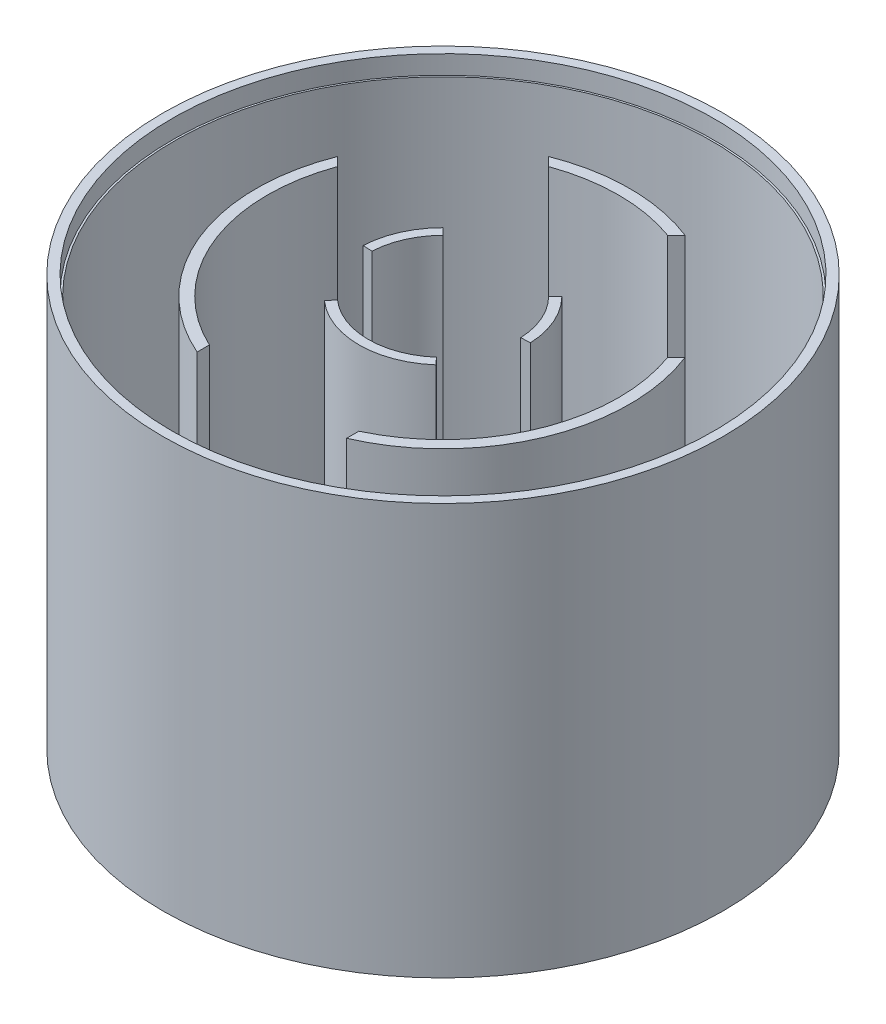
ISO-10303-21;
HEADER;
FILE_DESCRIPTION(('STEP AP214'),'2;1');
FILE_NAME('part.step','',(''),(''),'','','');
FILE_SCHEMA(('AUTOMOTIVE_DESIGN { 1 0 10303 214 1 1 1 1 }'));
ENDSEC;
DATA;
#1=APPLICATION_CONTEXT('core data for automotive mechanical design processes');
#2=APPLICATION_PROTOCOL_DEFINITION('international standard','automotive_design',2000,#1);
#3=PRODUCT_CONTEXT('',#1,'mechanical');
#4=PRODUCT('Part','Part','',(#3));
#5=PRODUCT_RELATED_PRODUCT_CATEGORY('part','',(#4));
#6=PRODUCT_DEFINITION_FORMATION('','',#4);
#7=PRODUCT_DEFINITION_CONTEXT('part definition',#1,'design');
#8=PRODUCT_DEFINITION('design','',#6,#7);
#9=PRODUCT_DEFINITION_SHAPE('','',#8);
#10=(LENGTH_UNIT() NAMED_UNIT(*) SI_UNIT(.MILLI.,.METRE.));
#11=(NAMED_UNIT(*) PLANE_ANGLE_UNIT() SI_UNIT($,.RADIAN.));
#12=(NAMED_UNIT(*) SI_UNIT($,.STERADIAN.) SOLID_ANGLE_UNIT());
#13=UNCERTAINTY_MEASURE_WITH_UNIT(LENGTH_MEASURE(1.E-05),#10,'distance_accuracy_value','');
#14=(GEOMETRIC_REPRESENTATION_CONTEXT(3) GLOBAL_UNCERTAINTY_ASSIGNED_CONTEXT((#13)) GLOBAL_UNIT_ASSIGNED_CONTEXT((#10,
#11,#12)) REPRESENTATION_CONTEXT('',''));
#15=CARTESIAN_POINT('',(0.,0.,0.));
#16=DIRECTION('',(0.,0.,1.));
#17=DIRECTION('',(1.,0.,0.));
#18=AXIS2_PLACEMENT_3D('',#15,#16,#17);
#19=CARTESIAN_POINT('',(0.,105.,0.));
#20=DIRECTION('',(0.,1.,0.));
#21=DIRECTION('',(0.,0.,1.));
#22=AXIS2_PLACEMENT_3D('',#19,#20,#21);
#23=PLANE('',#22);
#24=CARTESIAN_POINT('',(0.,105.,0.));
#25=DIRECTION('',(0.,1.,0.));
#26=DIRECTION('',(0.,0.,1.));
#27=AXIS2_PLACEMENT_3D('',#24,#25,#26);
#28=CIRCLE('',#27,50.);
#29=CARTESIAN_POINT('',(-46.5441828989868,105.,-18.2657887392159));
#30=VERTEX_POINT('',#29);
#31=CARTESIAN_POINT('',(-20.,105.,45.8257569495584));
#32=VERTEX_POINT('',#31);
#33=EDGE_CURVE('E330',#30,#32,#28,.T.);
#34=ORIENTED_EDGE('',*,*,#33,.T.);
#35=DIRECTION('',(0.,0.,-1.));
#36=VECTOR('',#35,1.);
#37=CARTESIAN_POINT('',(-20.,105.,0.));
#38=LINE('',#37,#36);
#39=CARTESIAN_POINT('',(-20.,105.,42.5323406362735));
#40=VERTEX_POINT('',#39);
#41=EDGE_CURVE('E434',#32,#40,#38,.T.);
#42=ORIENTED_EDGE('',*,*,#41,.T.);
#43=CARTESIAN_POINT('',(0.,105.,0.));
#44=DIRECTION('',(0.,1.,0.));
#45=DIRECTION('',(0.,0.,1.));
#46=AXIS2_PLACEMENT_3D('',#43,#44,#45);
#47=CIRCLE('',#46,47.);
#48=CARTESIAN_POINT('',(-44.2154851809154,105.,-15.9370910211446));
#49=VERTEX_POINT('',#48);
#50=EDGE_CURVE('E337',#49,#40,#47,.T.);
#51=ORIENTED_EDGE('',*,*,#50,.F.);
#52=DIRECTION('',(0.707106781186548,0.,0.707106781186547));
#53=VECTOR('',#52,1.);
#54=CARTESIAN_POINT('',(-14.1391970798854,105.,14.1391970798854));
#55=LINE('',#54,#53);
#56=EDGE_CURVE('E425',#30,#49,#55,.T.);
#57=ORIENTED_EDGE('',*,*,#56,.F.);
#58=EDGE_LOOP('',(#34,#42,#51,#57));
#59=FACE_BOUND('',#58,.T.);
#60=ADVANCED_FACE('F91',(#59),#23,.T.);
#61=DIRECTION('',(0.,0.,-1.));
#62=VECTOR('',#61,1.);
#63=CARTESIAN_POINT('',(20.,105.,0.));
#64=LINE('',#63,#62);
#65=CARTESIAN_POINT('',(20.,105.,45.8257569495584));
#66=VERTEX_POINT('',#65);
#67=CARTESIAN_POINT('',(20.,105.,42.5323406362735));
#68=VERTEX_POINT('',#67);
#69=EDGE_CURVE('E446',#66,#68,#64,.T.);
#70=ORIENTED_EDGE('',*,*,#69,.F.);
#71=CARTESIAN_POINT('',(46.547356757383,105.,-18.2576991677734));
#72=VERTEX_POINT('',#71);
#73=EDGE_CURVE('E322',#66,#72,#28,.T.);
#74=ORIENTED_EDGE('',*,*,#73,.T.);
#75=DIRECTION('',(-0.7071655496211,0.,0.707048007867279));
#76=VECTOR('',#75,1.);
#77=CARTESIAN_POINT('',(14.1409601573456,105.,14.143310992422));
#78=LINE('',#77,#76);
#79=CARTESIAN_POINT('',(44.2183662000678,105.,-15.9290957243877));
#80=VERTEX_POINT('',#79);
#81=EDGE_CURVE('E419',#72,#80,#78,.T.);
#82=ORIENTED_EDGE('',*,*,#81,.T.);
#83=EDGE_CURVE('E328',#68,#80,#47,.T.);
#84=ORIENTED_EDGE('',*,*,#83,.F.);
#85=EDGE_LOOP('',(#70,#74,#82,#84));
#86=FACE_BOUND('',#85,.T.);
#87=ADVANCED_FACE('F506',(#86),#23,.T.);
#88=DIRECTION('',(-0.7071655496211,0.,0.707048007867279));
#89=VECTOR('',#88,1.);
#90=CARTESIAN_POINT('',(-14.1409601573456,105.,-14.143310992422));
#91=LINE('',#90,#89);
#92=CARTESIAN_POINT('',(18.2654364426918,105.,-46.5443211526174));
#93=VERTEX_POINT('',#92);
#94=CARTESIAN_POINT('',(15.9364458853766,105.,-44.2157177092317));
#95=VERTEX_POINT('',#94);
#96=EDGE_CURVE('E411',#93,#95,#91,.T.);
#97=ORIENTED_EDGE('',*,*,#96,.F.);
#98=CARTESIAN_POINT('',(-18.257346680159,105.,-46.5474950153119));
#99=VERTEX_POINT('',#98);
#100=EDGE_CURVE('E333',#93,#99,#28,.T.);
#101=ORIENTED_EDGE('',*,*,#100,.T.);
#102=DIRECTION('',(0.707106781186548,0.,0.707106781186548));
#103=VECTOR('',#102,1.);
#104=CARTESIAN_POINT('',(14.1450741675765,105.,-14.1450741675765));
#105=LINE('',#104,#103);
#106=CARTESIAN_POINT('',(-15.9284503480795,105.,-44.2185986832325));
#107=VERTEX_POINT('',#106);
#108=EDGE_CURVE('E427',#99,#107,#105,.T.);
#109=ORIENTED_EDGE('',*,*,#108,.T.);
#110=EDGE_CURVE('E336',#95,#107,#47,.T.);
#111=ORIENTED_EDGE('',*,*,#110,.F.);
#112=EDGE_LOOP('',(#97,#101,#109,#111));
#113=FACE_BOUND('',#112,.T.);
#114=ADVANCED_FACE('F508',(#113),#23,.T.);
#115=CARTESIAN_POINT('',(0.,105.,0.));
#116=DIRECTION('',(0.,-1.,0.));
#117=DIRECTION('',(0.,0.,-1.));
#118=AXIS2_PLACEMENT_3D('',#115,#116,#117);
#119=CYLINDRICAL_SURFACE('',#118,50.);
#120=DIRECTION('',(0.,-1.,0.));
#121=VECTOR('',#120,1.);
#122=CARTESIAN_POINT('',(-20.,105.,45.8257569495584));
#123=LINE('',#122,#121);
#124=CARTESIAN_POINT('',(-20.,10.0000000000001,45.8257569495584));
#125=VERTEX_POINT('',#124);
#126=EDGE_CURVE('E357',#32,#125,#123,.T.);
#127=ORIENTED_EDGE('',*,*,#126,.F.);
#128=ORIENTED_EDGE('',*,*,#33,.F.);
#129=DIRECTION('',(0.,-1.,0.));
#130=VECTOR('',#129,1.);
#131=CARTESIAN_POINT('',(-46.5441828989868,105.,-18.2657887392159));
#132=LINE('',#131,#130);
#133=CARTESIAN_POINT('',(-46.5441828989868,10.0000000000001,-18.2657887392159));
#134=VERTEX_POINT('',#133);
#135=EDGE_CURVE('E375',#30,#134,#132,.T.);
#136=ORIENTED_EDGE('',*,*,#135,.T.);
#137=CARTESIAN_POINT('',(0.,10.0000000000001,0.));
#138=DIRECTION('',(0.,1.,0.));
#139=DIRECTION('',(0.,0.,1.));
#140=AXIS2_PLACEMENT_3D('',#137,#138,#139);
#141=CIRCLE('',#140,50.);
#142=EDGE_CURVE('E324',#134,#125,#141,.T.);
#143=ORIENTED_EDGE('',*,*,#142,.T.);
#144=EDGE_LOOP('',(#127,#128,#136,#143));
#145=FACE_BOUND('',#144,.T.);
#146=ADVANCED_FACE('F517',(#145),#119,.T.);
#147=ORIENTED_EDGE('',*,*,#73,.F.);
#148=DIRECTION('',(0.,-1.,0.));
#149=VECTOR('',#148,1.);
#150=CARTESIAN_POINT('',(20.,105.,45.8257569495584));
#151=LINE('',#150,#149);
#152=CARTESIAN_POINT('',(20.,10.0000000000001,45.8257569495584));
#153=VERTEX_POINT('',#152);
#154=EDGE_CURVE('E352',#66,#153,#151,.T.);
#155=ORIENTED_EDGE('',*,*,#154,.T.);
#156=CARTESIAN_POINT('',(46.547356757383,10.0000000000001,-18.2576991677734));
#157=VERTEX_POINT('',#156);
#158=EDGE_CURVE('E329',#153,#157,#141,.T.);
#159=ORIENTED_EDGE('',*,*,#158,.T.);
#160=DIRECTION('',(0.,-1.,0.));
#161=VECTOR('',#160,1.);
#162=CARTESIAN_POINT('',(46.547356757383,105.,-18.2576991677734));
#163=LINE('',#162,#161);
#164=EDGE_CURVE('E366',#72,#157,#163,.T.);
#165=ORIENTED_EDGE('',*,*,#164,.F.);
#166=EDGE_LOOP('',(#147,#155,#159,#165));
#167=FACE_BOUND('',#166,.T.);
#168=ADVANCED_FACE('F522',(#167),#119,.T.);
#169=ORIENTED_EDGE('',*,*,#100,.F.);
#170=DIRECTION('',(0.,-1.,0.));
#171=VECTOR('',#170,1.);
#172=CARTESIAN_POINT('',(18.2654364426918,105.,-46.5443211526174));
#173=LINE('',#172,#171);
#174=CARTESIAN_POINT('',(18.2654364426918,10.0000000000001,-46.5443211526174));
#175=VERTEX_POINT('',#174);
#176=EDGE_CURVE('E361',#93,#175,#173,.T.);
#177=ORIENTED_EDGE('',*,*,#176,.T.);
#178=CARTESIAN_POINT('',(-18.257346680159,10.0000000000001,-46.5474950153119));
#179=VERTEX_POINT('',#178);
#180=EDGE_CURVE('E327',#175,#179,#141,.T.);
#181=ORIENTED_EDGE('',*,*,#180,.T.);
#182=DIRECTION('',(0.,-1.,0.));
#183=VECTOR('',#182,1.);
#184=CARTESIAN_POINT('',(-18.257346680159,105.,-46.5474950153119));
#185=LINE('',#184,#183);
#186=EDGE_CURVE('E370',#99,#179,#185,.T.);
#187=ORIENTED_EDGE('',*,*,#186,.F.);
#188=EDGE_LOOP('',(#169,#177,#181,#187));
#189=FACE_BOUND('',#188,.T.);
#190=ADVANCED_FACE('F524',(#189),#119,.T.);
#191=CARTESIAN_POINT('',(0.,105.,0.));
#192=DIRECTION('',(0.,-1.,0.));
#193=DIRECTION('',(0.,0.,-1.));
#194=AXIS2_PLACEMENT_3D('',#191,#192,#193);
#195=CYLINDRICAL_SURFACE('',#194,47.);
#196=ORIENTED_EDGE('',*,*,#50,.T.);
#197=DIRECTION('',(0.,-1.,0.));
#198=VECTOR('',#197,1.);
#199=CARTESIAN_POINT('',(-20.,105.,42.5323406362735));
#200=LINE('',#199,#198);
#201=CARTESIAN_POINT('',(-20.,10.0000000000001,42.5323406362735));
#202=VERTEX_POINT('',#201);
#203=EDGE_CURVE('E359',#40,#202,#200,.T.);
#204=ORIENTED_EDGE('',*,*,#203,.T.);
#205=CARTESIAN_POINT('',(0.,10.0000000000001,0.));
#206=DIRECTION('',(0.,1.,0.));
#207=DIRECTION('',(0.,0.,1.));
#208=AXIS2_PLACEMENT_3D('',#205,#206,#207);
#209=CIRCLE('',#208,47.);
#210=CARTESIAN_POINT('',(-44.2154851809154,10.0000000000001,-15.9370910211446));
#211=VERTEX_POINT('',#210);
#212=EDGE_CURVE('E281',#202,#211,#209,.F.);
#213=ORIENTED_EDGE('',*,*,#212,.T.);
#214=DIRECTION('',(0.,-1.,0.));
#215=VECTOR('',#214,1.);
#216=CARTESIAN_POINT('',(-44.2154851809154,105.,-15.9370910211446));
#217=LINE('',#216,#215);
#218=EDGE_CURVE('E378',#49,#211,#217,.T.);
#219=ORIENTED_EDGE('',*,*,#218,.F.);
#220=EDGE_LOOP('',(#196,#204,#213,#219));
#221=FACE_BOUND('',#220,.T.);
#222=ADVANCED_FACE('F459',(#221),#195,.F.);
#223=DIRECTION('',(0.,-1.,0.));
#224=VECTOR('',#223,1.);
#225=CARTESIAN_POINT('',(20.,105.,42.5323406362735));
#226=LINE('',#225,#224);
#227=CARTESIAN_POINT('',(20.,10.0000000000001,42.5323406362735));
#228=VERTEX_POINT('',#227);
#229=EDGE_CURVE('E355',#68,#228,#226,.T.);
#230=ORIENTED_EDGE('',*,*,#229,.F.);
#231=ORIENTED_EDGE('',*,*,#83,.T.);
#232=DIRECTION('',(0.,-1.,0.));
#233=VECTOR('',#232,1.);
#234=CARTESIAN_POINT('',(44.2183662000678,105.,-15.9290957243877));
#235=LINE('',#234,#233);
#236=CARTESIAN_POINT('',(44.2183662000678,10.0000000000001,-15.9290957243877));
#237=VERTEX_POINT('',#236);
#238=EDGE_CURVE('E368',#80,#237,#235,.T.);
#239=ORIENTED_EDGE('',*,*,#238,.T.);
#240=EDGE_CURVE('E288',#237,#228,#209,.F.);
#241=ORIENTED_EDGE('',*,*,#240,.T.);
#242=EDGE_LOOP('',(#230,#231,#239,#241));
#243=FACE_BOUND('',#242,.T.);
#244=ADVANCED_FACE('F582',(#243),#195,.F.);
#245=DIRECTION('',(0.,-1.,0.));
#246=VECTOR('',#245,1.);
#247=CARTESIAN_POINT('',(15.9364458853766,105.,-44.2157177092317));
#248=LINE('',#247,#246);
#249=CARTESIAN_POINT('',(15.9364458853766,10.0000000000001,-44.2157177092317));
#250=VERTEX_POINT('',#249);
#251=EDGE_CURVE('E364',#95,#250,#248,.T.);
#252=ORIENTED_EDGE('',*,*,#251,.F.);
#253=ORIENTED_EDGE('',*,*,#110,.T.);
#254=DIRECTION('',(0.,-1.,0.));
#255=VECTOR('',#254,1.);
#256=CARTESIAN_POINT('',(-15.9284503480795,105.,-44.2185986832325));
#257=LINE('',#256,#255);
#258=CARTESIAN_POINT('',(-15.9284503480795,10.0000000000001,-44.2185986832325));
#259=VERTEX_POINT('',#258);
#260=EDGE_CURVE('E372',#107,#259,#257,.T.);
#261=ORIENTED_EDGE('',*,*,#260,.T.);
#262=EDGE_CURVE('E287',#259,#250,#209,.F.);
#263=ORIENTED_EDGE('',*,*,#262,.T.);
#264=EDGE_LOOP('',(#252,#253,#261,#263));
#265=FACE_BOUND('',#264,.T.);
#266=ADVANCED_FACE('F547',(#265),#195,.F.);
#267=CARTESIAN_POINT('',(0.,105.,0.));
#268=DIRECTION('',(0.,1.,0.));
#269=DIRECTION('',(0.,0.,1.));
#270=AXIS2_PLACEMENT_3D('',#267,#268,#269);
#271=PLANE('',#270);
#272=CARTESIAN_POINT('',(0.,105.,0.));
#273=DIRECTION('',(0.,1.,0.));
#274=DIRECTION('',(0.,0.,1.));
#275=AXIS2_PLACEMENT_3D('',#272,#273,#274);
#276=CIRCLE('',#275,20.);
#277=CARTESIAN_POINT('',(-14.1409601573456,105.,-14.143310992422));
#278=VERTEX_POINT('',#277);
#279=CARTESIAN_POINT('',(-19.9766892104557,105.,-0.965343560016029));
#280=VERTEX_POINT('',#279);
#281=EDGE_CURVE('E351',#278,#280,#276,.T.);
#282=ORIENTED_EDGE('',*,*,#281,.F.);
#283=DIRECTION('',(-0.707048007867279,0.,-0.7071655496211));
#284=VECTOR('',#283,1.);
#285=CARTESIAN_POINT('',(0.,105.,0.));
#286=LINE('',#285,#284);
#287=CARTESIAN_POINT('',(-15.9085801770138,105.,-15.9112248664748));
#288=VERTEX_POINT('',#287);
#289=EDGE_CURVE('E442',#278,#288,#286,.T.);
#290=ORIENTED_EDGE('',*,*,#289,.T.);
#291=CARTESIAN_POINT('',(0.,105.,0.));
#292=DIRECTION('',(0.,1.,0.));
#293=DIRECTION('',(0.,0.,1.));
#294=AXIS2_PLACEMENT_3D('',#291,#292,#293);
#295=CIRCLE('',#294,22.5);
#296=CARTESIAN_POINT('',(-22.4737753617626,105.,-1.08601150501803));
#297=VERTEX_POINT('',#296);
#298=EDGE_CURVE('E346',#288,#297,#295,.T.);
#299=ORIENTED_EDGE('',*,*,#298,.T.);
#300=DIRECTION('',(-0.998834460522783,0.,-0.0482671780008014));
#301=VECTOR('',#300,1.);
#302=CARTESIAN_POINT('',(0.,105.,0.));
#303=LINE('',#302,#301);
#304=EDGE_CURVE('E412',#280,#297,#303,.T.);
#305=ORIENTED_EDGE('',*,*,#304,.F.);
#306=EDGE_LOOP('',(#282,#290,#299,#305));
#307=FACE_BOUND('',#306,.T.);
#308=ADVANCED_FACE('F475',(#307),#271,.T.);
#309=DIRECTION('',(0.7071655496211,0.,-0.707048007867279));
#310=VECTOR('',#309,1.);
#311=CARTESIAN_POINT('',(0.,105.,0.));
#312=LINE('',#311,#310);
#313=CARTESIAN_POINT('',(14.143310992422,105.,-14.1409601573456));
#314=VERTEX_POINT('',#313);
#315=CARTESIAN_POINT('',(15.9112248664748,105.,-15.9085801770138));
#316=VERTEX_POINT('',#315);
#317=EDGE_CURVE('E440',#314,#316,#312,.T.);
#318=ORIENTED_EDGE('',*,*,#317,.F.);
#319=CARTESIAN_POINT('',(19.9828556126957,105.,-0.827938139088288));
#320=VERTEX_POINT('',#319);
#321=EDGE_CURVE('E274',#320,#314,#276,.T.);
#322=ORIENTED_EDGE('',*,*,#321,.F.);
#323=DIRECTION('',(0.999142780634784,0.,-0.0413969069544144));
#324=VECTOR('',#323,1.);
#325=CARTESIAN_POINT('',(0.,105.,0.));
#326=LINE('',#325,#324);
#327=CARTESIAN_POINT('',(22.4807125642826,105.,-0.931430406474324));
#328=VERTEX_POINT('',#327);
#329=EDGE_CURVE('E394',#320,#328,#326,.T.);
#330=ORIENTED_EDGE('',*,*,#329,.T.);
#331=EDGE_CURVE('E347',#328,#316,#295,.T.);
#332=ORIENTED_EDGE('',*,*,#331,.T.);
#333=EDGE_LOOP('',(#318,#322,#330,#332));
#334=FACE_BOUND('',#333,.T.);
#335=ADVANCED_FACE('F577',(#334),#271,.T.);
#336=CARTESIAN_POINT('',(0.,105.,0.));
#337=DIRECTION('',(0.,-1.,0.));
#338=DIRECTION('',(0.,0.,-1.));
#339=AXIS2_PLACEMENT_3D('',#336,#337,#338);
#340=CYLINDRICAL_SURFACE('',#339,22.5);
#341=DIRECTION('',(0.,1.,0.));
#342=VECTOR('',#341,1.);
#343=CARTESIAN_POINT('',(-15.9085801770138,10.0000000000001,-15.9112248664748));
#344=LINE('',#343,#342);
#345=CARTESIAN_POINT('',(-15.9085801770138,10.0000000000001,-15.9112248664748));
#346=VERTEX_POINT('',#345);
#347=EDGE_CURVE('E397',#346,#288,#344,.T.);
#348=ORIENTED_EDGE('',*,*,#347,.F.);
#349=CARTESIAN_POINT('',(0.,10.0000000000001,0.));
#350=DIRECTION('',(0.,1.,0.));
#351=DIRECTION('',(0.,0.,1.));
#352=AXIS2_PLACEMENT_3D('',#349,#350,#351);
#353=CIRCLE('',#352,22.5);
#354=CARTESIAN_POINT('',(-22.4737753617626,10.0000000000001,-1.08601150501803));
#355=VERTEX_POINT('',#354);
#356=EDGE_CURVE('E341',#346,#355,#353,.T.);
#357=ORIENTED_EDGE('',*,*,#356,.T.);
#358=DIRECTION('',(0.,1.,0.));
#359=VECTOR('',#358,1.);
#360=CARTESIAN_POINT('',(-22.4737753617626,10.0000000000001,-1.08601150501803));
#361=LINE('',#360,#359);
#362=EDGE_CURVE('E408',#355,#297,#361,.T.);
#363=ORIENTED_EDGE('',*,*,#362,.T.);
#364=ORIENTED_EDGE('',*,*,#298,.F.);
#365=EDGE_LOOP('',(#348,#357,#363,#364));
#366=FACE_BOUND('',#365,.T.);
#367=ADVANCED_FACE('F479',(#366),#340,.T.);
#368=CARTESIAN_POINT('',(22.4807125642826,10.0000000000001,-0.931430406474324));
#369=VERTEX_POINT('',#368);
#370=CARTESIAN_POINT('',(15.9112248664748,10.0000000000001,-15.9085801770138));
#371=VERTEX_POINT('',#370);
#372=EDGE_CURVE('E342',#369,#371,#353,.T.);
#373=ORIENTED_EDGE('',*,*,#372,.T.);
#374=DIRECTION('',(0.,1.,0.));
#375=VECTOR('',#374,1.);
#376=CARTESIAN_POINT('',(15.9112248664748,10.0000000000001,-15.9085801770138));
#377=LINE('',#376,#375);
#378=EDGE_CURVE('E260',#371,#316,#377,.T.);
#379=ORIENTED_EDGE('',*,*,#378,.T.);
#380=ORIENTED_EDGE('',*,*,#331,.F.);
#381=DIRECTION('',(0.,1.,0.));
#382=VECTOR('',#381,1.);
#383=CARTESIAN_POINT('',(22.4807125642826,10.0000000000001,-0.931430406474324));
#384=LINE('',#383,#382);
#385=EDGE_CURVE('E389',#369,#328,#384,.T.);
#386=ORIENTED_EDGE('',*,*,#385,.F.);
#387=EDGE_LOOP('',(#373,#379,#380,#386));
#388=FACE_BOUND('',#387,.T.);
#389=ADVANCED_FACE('F580',(#388),#340,.T.);
#390=CARTESIAN_POINT('',(0.,105.,0.));
#391=DIRECTION('',(0.,-1.,0.));
#392=DIRECTION('',(0.,0.,-1.));
#393=AXIS2_PLACEMENT_3D('',#390,#391,#392);
#394=CYLINDRICAL_SURFACE('',#393,20.);
#395=CARTESIAN_POINT('',(0.,10.0000000000001,0.));
#396=DIRECTION('',(0.,1.,0.));
#397=DIRECTION('',(0.,0.,1.));
#398=AXIS2_PLACEMENT_3D('',#395,#396,#397);
#399=CIRCLE('',#398,20.);
#400=CARTESIAN_POINT('',(-19.9766892104557,10.0000000000001,-0.965343560016029));
#401=VERTEX_POINT('',#400);
#402=CARTESIAN_POINT('',(-14.1409601573456,10.0000000000001,-14.143310992422));
#403=VERTEX_POINT('',#402);
#404=EDGE_CURVE('E12',#401,#403,#399,.F.);
#405=ORIENTED_EDGE('',*,*,#404,.T.);
#406=DIRECTION('',(0.,1.,0.));
#407=VECTOR('',#406,1.);
#408=CARTESIAN_POINT('',(-14.1409601573456,10.0000000000001,-14.143310992422));
#409=LINE('',#408,#407);
#410=EDGE_CURVE('E265',#403,#278,#409,.T.);
#411=ORIENTED_EDGE('',*,*,#410,.T.);
#412=ORIENTED_EDGE('',*,*,#281,.T.);
#413=DIRECTION('',(0.,1.,0.));
#414=VECTOR('',#413,1.);
#415=CARTESIAN_POINT('',(-19.9766892104557,10.0000000000001,-0.965343560016029));
#416=LINE('',#415,#414);
#417=EDGE_CURVE('E406',#401,#280,#416,.T.);
#418=ORIENTED_EDGE('',*,*,#417,.F.);
#419=EDGE_LOOP('',(#405,#411,#412,#418));
#420=FACE_BOUND('',#419,.T.);
#421=ADVANCED_FACE('F489',(#420),#394,.F.);
#422=DIRECTION('',(0.,1.,0.));
#423=VECTOR('',#422,1.);
#424=CARTESIAN_POINT('',(14.143310992422,10.0000000000001,-14.1409601573456));
#425=LINE('',#424,#423);
#426=CARTESIAN_POINT('',(14.143310992422,10.0000000000001,-14.1409601573456));
#427=VERTEX_POINT('',#426);
#428=EDGE_CURVE('E257',#427,#314,#425,.T.);
#429=ORIENTED_EDGE('',*,*,#428,.F.);
#430=CARTESIAN_POINT('',(19.9828556126957,10.0000000000001,-0.827938139088288));
#431=VERTEX_POINT('',#430);
#432=EDGE_CURVE('E100',#427,#431,#399,.F.);
#433=ORIENTED_EDGE('',*,*,#432,.T.);
#434=DIRECTION('',(0.,1.,0.));
#435=VECTOR('',#434,1.);
#436=CARTESIAN_POINT('',(19.9828556126957,10.0000000000001,-0.827938139088288));
#437=LINE('',#436,#435);
#438=EDGE_CURVE('E381',#431,#320,#437,.T.);
#439=ORIENTED_EDGE('',*,*,#438,.T.);
#440=ORIENTED_EDGE('',*,*,#321,.T.);
#441=EDGE_LOOP('',(#429,#433,#439,#440));
#442=FACE_BOUND('',#441,.T.);
#443=ADVANCED_FACE('F271',(#442),#394,.F.);
#444=CARTESIAN_POINT('',(0.,110.,0.));
#445=DIRECTION('',(0.,-1.,0.));
#446=DIRECTION('',(0.,0.,-1.));
#447=AXIS2_PLACEMENT_3D('',#444,#445,#446);
#448=CYLINDRICAL_SURFACE('',#447,75.0000000000002);
#449=CARTESIAN_POINT('',(0.,110.,0.));
#450=DIRECTION('',(0.,1.,0.));
#451=DIRECTION('',(0.,0.,1.));
#452=AXIS2_PLACEMENT_3D('',#449,#450,#451);
#453=CIRCLE('',#452,75.0000000000002);
#454=CARTESIAN_POINT('',(0.,110.,-75.0000000000002));
#455=VERTEX_POINT('',#454);
#456=EDGE_CURVE('E296',#455,#455,#453,.T.);
#457=CARTESIAN_POINT('',(0.,0.,0.));
#458=DIRECTION('',(0.,1.,0.));
#459=DIRECTION('',(0.,0.,1.));
#460=AXIS2_PLACEMENT_3D('',#457,#458,#459);
#461=CIRCLE('',#460,75.0000000000002);
#462=CARTESIAN_POINT('',(0.,0.,-75.0000000000002));
#463=VERTEX_POINT('',#462);
#464=EDGE_CURVE('E301',#463,#463,#461,.T.);
#465=CARTESIAN_POINT('',(0.,110.,-75.0000000000002));
#466=CARTESIAN_POINT('',(0.,108.854166666667,-75.0000000000002));
#467=CARTESIAN_POINT('',(0.,107.708333333333,-75.0000000000002));
#468=CARTESIAN_POINT('',(0.,105.416666666667,-75.0000000000002));
#469=CARTESIAN_POINT('',(0.,104.270833333333,-75.0000000000002));
#470=CARTESIAN_POINT('',(0.,101.979166666667,-75.0000000000002));
#471=CARTESIAN_POINT('',(0.,100.833333333333,-75.0000000000002));
#472=CARTESIAN_POINT('',(0.,98.5416666666667,-75.0000000000002));
#473=CARTESIAN_POINT('',(0.,97.3958333333334,-75.0000000000002));
#474=CARTESIAN_POINT('',(0.,95.1041666666667,-75.0000000000002));
#475=CARTESIAN_POINT('',(0.,93.9583333333334,-75.0000000000002));
#476=CARTESIAN_POINT('',(0.,91.6666666666667,-75.0000000000002));
#477=CARTESIAN_POINT('',(0.,90.5208333333334,-75.0000000000002));
#478=CARTESIAN_POINT('',(0.,88.2291666666667,-75.0000000000002));
#479=CARTESIAN_POINT('',(0.,87.0833333333334,-75.0000000000002));
#480=CARTESIAN_POINT('',(0.,84.7916666666667,-75.0000000000002));
#481=CARTESIAN_POINT('',(0.,83.6458333333334,-75.0000000000002));
#482=CARTESIAN_POINT('',(0.,81.3541666666667,-75.0000000000002));
#483=CARTESIAN_POINT('',(0.,80.2083333333334,-75.0000000000002));
#484=CARTESIAN_POINT('',(0.,77.9166666666667,-75.0000000000002));
#485=CARTESIAN_POINT('',(0.,76.7708333333334,-75.0000000000002));
#486=CARTESIAN_POINT('',(0.,74.4791666666667,-75.0000000000002));
#487=CARTESIAN_POINT('',(0.,73.3333333333334,-75.0000000000002));
#488=CARTESIAN_POINT('',(0.,71.0416666666667,-75.0000000000002));
#489=CARTESIAN_POINT('',(0.,69.8958333333334,-75.0000000000002));
#490=CARTESIAN_POINT('',(0.,67.6041666666667,-75.0000000000002));
#491=CARTESIAN_POINT('',(0.,66.4583333333334,-75.0000000000002));
#492=CARTESIAN_POINT('',(0.,64.1666666666667,-75.0000000000002));
#493=CARTESIAN_POINT('',(0.,63.0208333333334,-75.0000000000002));
#494=CARTESIAN_POINT('',(0.,60.7291666666667,-75.0000000000002));
#495=CARTESIAN_POINT('',(0.,59.5833333333334,-75.0000000000002));
#496=CARTESIAN_POINT('',(0.,57.2916666666667,-75.0000000000002));
#497=CARTESIAN_POINT('',(0.,56.1458333333334,-75.0000000000002));
#498=CARTESIAN_POINT('',(0.,53.8541666666667,-75.0000000000002));
#499=CARTESIAN_POINT('',(0.,52.7083333333334,-75.0000000000002));
#500=CARTESIAN_POINT('',(0.,50.4166666666667,-75.0000000000002));
#501=CARTESIAN_POINT('',(0.,49.2708333333334,-75.0000000000002));
#502=CARTESIAN_POINT('',(0.,46.9791666666667,-75.0000000000002));
#503=CARTESIAN_POINT('',(0.,45.8333333333333,-75.0000000000002));
#504=CARTESIAN_POINT('',(0.,43.5416666666667,-75.0000000000002));
#505=CARTESIAN_POINT('',(0.,42.3958333333334,-75.0000000000002));
#506=CARTESIAN_POINT('',(0.,40.1041666666667,-75.0000000000002));
#507=CARTESIAN_POINT('',(0.,38.9583333333333,-75.0000000000002));
#508=CARTESIAN_POINT('',(0.,36.6666666666667,-75.0000000000002));
#509=CARTESIAN_POINT('',(0.,35.5208333333333,-75.0000000000002));
#510=CARTESIAN_POINT('',(0.,33.2291666666667,-75.0000000000002));
#511=CARTESIAN_POINT('',(0.,32.0833333333333,-75.0000000000002));
#512=CARTESIAN_POINT('',(0.,29.7916666666667,-75.0000000000002));
#513=CARTESIAN_POINT('',(0.,28.6458333333333,-75.0000000000002));
#514=CARTESIAN_POINT('',(0.,26.3541666666667,-75.0000000000002));
#515=CARTESIAN_POINT('',(0.,25.2083333333333,-75.0000000000002));
#516=CARTESIAN_POINT('',(0.,22.9166666666667,-75.0000000000002));
#517=CARTESIAN_POINT('',(0.,21.7708333333333,-75.0000000000002));
#518=CARTESIAN_POINT('',(0.,19.4791666666667,-75.0000000000002));
#519=CARTESIAN_POINT('',(0.,18.3333333333333,-75.0000000000002));
#520=CARTESIAN_POINT('',(0.,16.0416666666667,-75.0000000000002));
#521=CARTESIAN_POINT('',(0.,14.8958333333333,-75.0000000000002));
#522=CARTESIAN_POINT('',(0.,12.6041666666667,-75.0000000000002));
#523=CARTESIAN_POINT('',(0.,11.4583333333333,-75.0000000000002));
#524=CARTESIAN_POINT('',(0.,9.16666666666666,-75.0000000000002));
#525=CARTESIAN_POINT('',(0.,8.02083333333333,-75.0000000000002));
#526=CARTESIAN_POINT('',(0.,5.72916666666666,-75.0000000000002));
#527=CARTESIAN_POINT('',(0.,4.58333333333332,-75.0000000000002));
#528=CARTESIAN_POINT('',(0.,2.29166666666665,-75.0000000000002));
#529=CARTESIAN_POINT('',(0.,1.14583333333332,-75.0000000000002));
#530=CARTESIAN_POINT('',(0.,0.,-75.0000000000002));
#531=B_SPLINE_CURVE_WITH_KNOTS('',3,(#465,#466,#467,#468,#469,#470,#471,#472,#473,#474,#475,
#476,#477,#478,#479,#480,#481,#482,#483,#484,#485,#486,#487,#488,#489,#490,#491,#492,#493,#494,
#495,#496,#497,#498,#499,#500,#501,#502,#503,#504,#505,#506,#507,#508,#509,#510,#511,#512,#513,
#514,#515,#516,#517,#518,#519,#520,#521,#522,#523,#524,#525,#526,#527,#528,#529,#530),
.UNSPECIFIED.,.F.,.F.,(4,2,2,2,2,2,2,2,2,2,2,2,2,2,2,2,2,2,2,2,2,2,2,2,2,2,2,2,2,2,2,2,4),(0.,
3.4375,6.87499999999999,10.3125,13.75,17.1875,20.625,24.0625,27.5,30.9375,34.375,37.8125,41.25,
44.6875,48.125,51.5625,55.,58.4375,61.875,65.3125,68.75,72.1875,75.625,79.0625,82.5,
85.9375000000001,89.3750000000001,92.8125000000001,96.2500000000001,99.6875000000001,103.125,
106.5625,110.),.UNSPECIFIED.);
#532=EDGE_CURVE('BSEAM93',#455,#463,#531,.T.);
#533=ORIENTED_EDGE('',*,*,#456,.F.);
#534=ORIENTED_EDGE('',*,*,#464,.T.);
#535=ORIENTED_EDGE('',*,*,#532,.T.);
#536=ORIENTED_EDGE('',*,*,#532,.F.);
#537=EDGE_LOOP('',(#533,#535,#534,#536));
#538=FACE_BOUND('',#537,.T.);
#539=ADVANCED_FACE('F93',(#538),#448,.T.);
#540=CARTESIAN_POINT('',(0.,110.,0.));
#541=DIRECTION('',(0.,1.,0.));
#542=DIRECTION('',(0.,0.,1.));
#543=AXIS2_PLACEMENT_3D('',#540,#541,#542);
#544=PLANE('',#543);
#545=CARTESIAN_POINT('',(0.,110.,0.));
#546=DIRECTION('',(0.,1.,0.));
#547=DIRECTION('',(0.,0.,1.));
#548=AXIS2_PLACEMENT_3D('',#545,#546,#547);
#549=CIRCLE('',#548,72.5);
#550=CARTESIAN_POINT('',(0.,110.,72.5));
#551=VERTEX_POINT('',#550);
#552=EDGE_CURVE('E317',#551,#551,#549,.T.);
#553=ORIENTED_EDGE('',*,*,#552,.F.);
#554=EDGE_LOOP('',(#553));
#555=FACE_BOUND('',#554,.T.);
#556=ORIENTED_EDGE('',*,*,#456,.T.);
#557=EDGE_LOOP('',(#556));
#558=FACE_BOUND('',#557,.T.);
#559=ADVANCED_FACE('F610',(#555,#558),#544,.T.);
#560=CARTESIAN_POINT('',(0.,0.,0.));
#561=DIRECTION('',(0.,1.,0.));
#562=DIRECTION('',(0.,0.,1.));
#563=AXIS2_PLACEMENT_3D('',#560,#561,#562);
#564=PLANE('',#563);
#565=ORIENTED_EDGE('',*,*,#464,.F.);
#566=EDGE_LOOP('',(#565));
#567=FACE_BOUND('',#566,.T.);
#568=ADVANCED_FACE('F616',(#567),#564,.F.);
#569=CARTESIAN_POINT('',(0.,105.,0.));
#570=DIRECTION('',(0.,1.,0.));
#571=DIRECTION('',(0.,0.,1.));
#572=AXIS2_PLACEMENT_3D('',#569,#570,#571);
#573=PLANE('',#572);
#574=CARTESIAN_POINT('',(0.,105.,0.));
#575=DIRECTION('',(0.,1.,0.));
#576=DIRECTION('',(0.,0.,1.));
#577=AXIS2_PLACEMENT_3D('',#574,#575,#576);
#578=CIRCLE('',#577,72.5);
#579=CARTESIAN_POINT('',(0.,105.,72.5));
#580=VERTEX_POINT('',#579);
#581=EDGE_CURVE('E312',#580,#580,#578,.T.);
#582=ORIENTED_EDGE('',*,*,#581,.T.);
#583=EDGE_LOOP('',(#582));
#584=FACE_BOUND('',#583,.T.);
#585=CARTESIAN_POINT('',(0.,105.,0.));
#586=DIRECTION('',(0.,1.,0.));
#587=DIRECTION('',(0.,0.,1.));
#588=AXIS2_PLACEMENT_3D('',#585,#586,#587);
#589=CIRCLE('',#588,72.);
#590=CARTESIAN_POINT('',(0.,105.,72.));
#591=VERTEX_POINT('',#590);
#592=EDGE_CURVE('E310',#591,#591,#589,.F.);
#593=ORIENTED_EDGE('',*,*,#592,.T.);
#594=EDGE_LOOP('',(#593));
#595=FACE_BOUND('',#594,.T.);
#596=ADVANCED_FACE('F622',(#584,#595),#573,.T.);
#597=CARTESIAN_POINT('',(0.,105.,0.));
#598=DIRECTION('',(0.,1.,0.));
#599=DIRECTION('',(0.,0.,1.));
#600=AXIS2_PLACEMENT_3D('',#597,#598,#599);
#601=CYLINDRICAL_SURFACE('',#600,72.5);
#602=ORIENTED_EDGE('',*,*,#581,.F.);
#603=EDGE_LOOP('',(#602));
#604=FACE_BOUND('',#603,.T.);
#605=ORIENTED_EDGE('',*,*,#552,.T.);
#606=EDGE_LOOP('',(#605));
#607=FACE_BOUND('',#606,.T.);
#608=ADVANCED_FACE('F626',(#604,#607),#601,.F.);
#609=CARTESIAN_POINT('',(0.,10.0000000000001,0.));
#610=DIRECTION('',(0.,1.,0.));
#611=DIRECTION('',(0.,0.,1.));
#612=AXIS2_PLACEMENT_3D('',#609,#610,#611);
#613=PLANE('',#612);
#614=ORIENTED_EDGE('',*,*,#158,.F.);
#615=DIRECTION('',(0.,0.,-1.));
#616=VECTOR('',#615,1.);
#617=CARTESIAN_POINT('',(20.,10.0000000000001,0.));
#618=LINE('',#617,#616);
#619=EDGE_CURVE('E107',#153,#228,#618,.T.);
#620=ORIENTED_EDGE('',*,*,#619,.T.);
#621=ORIENTED_EDGE('',*,*,#240,.F.);
#622=DIRECTION('',(-0.7071655496211,0.,0.707048007867279));
#623=VECTOR('',#622,1.);
#624=CARTESIAN_POINT('',(14.1409601573456,10.0000000000001,14.143310992422));
#625=LINE('',#624,#623);
#626=EDGE_CURVE('E423',#157,#237,#625,.T.);
#627=ORIENTED_EDGE('',*,*,#626,.F.);
#628=EDGE_LOOP('',(#614,#620,#621,#627));
#629=FACE_BOUND('',#628,.T.);
#630=DIRECTION('',(0.,0.,-1.));
#631=VECTOR('',#630,1.);
#632=CARTESIAN_POINT('',(-20.,10.0000000000001,0.));
#633=LINE('',#632,#631);
#634=EDGE_CURVE('E448',#125,#202,#633,.T.);
#635=ORIENTED_EDGE('',*,*,#634,.F.);
#636=ORIENTED_EDGE('',*,*,#142,.F.);
#637=DIRECTION('',(0.707106781186548,0.,0.707106781186547));
#638=VECTOR('',#637,1.);
#639=CARTESIAN_POINT('',(-14.1391970798854,10.0000000000001,14.1391970798854));
#640=LINE('',#639,#638);
#641=EDGE_CURVE('E430',#134,#211,#640,.T.);
#642=ORIENTED_EDGE('',*,*,#641,.T.);
#643=ORIENTED_EDGE('',*,*,#212,.F.);
#644=EDGE_LOOP('',(#635,#636,#642,#643));
#645=FACE_BOUND('',#644,.T.);
#646=ORIENTED_EDGE('',*,*,#180,.F.);
#647=DIRECTION('',(-0.7071655496211,0.,0.707048007867279));
#648=VECTOR('',#647,1.);
#649=CARTESIAN_POINT('',(-14.1409601573456,10.0000000000001,-14.143310992422));
#650=LINE('',#649,#648);
#651=EDGE_CURVE('E115',#175,#250,#650,.T.);
#652=ORIENTED_EDGE('',*,*,#651,.T.);
#653=ORIENTED_EDGE('',*,*,#262,.F.);
#654=DIRECTION('',(0.707106781186548,0.,0.707106781186548));
#655=VECTOR('',#654,1.);
#656=CARTESIAN_POINT('',(14.1450741675765,10.0000000000001,-14.1450741675765));
#657=LINE('',#656,#655);
#658=EDGE_CURVE('E432',#179,#259,#657,.T.);
#659=ORIENTED_EDGE('',*,*,#658,.F.);
#660=EDGE_LOOP('',(#646,#652,#653,#659));
#661=FACE_BOUND('',#660,.T.);
#662=ORIENTED_EDGE('',*,*,#356,.F.);
#663=DIRECTION('',(-0.707048007867279,0.,-0.7071655496211));
#664=VECTOR('',#663,1.);
#665=CARTESIAN_POINT('',(0.,10.0000000000001,0.));
#666=LINE('',#665,#664);
#667=EDGE_CURVE('E266',#403,#346,#666,.T.);
#668=ORIENTED_EDGE('',*,*,#667,.F.);
#669=ORIENTED_EDGE('',*,*,#404,.F.);
#670=DIRECTION('',(-0.998834460522783,0.,-0.0482671780008014));
#671=VECTOR('',#670,1.);
#672=CARTESIAN_POINT('',(0.,10.0000000000001,0.));
#673=LINE('',#672,#671);
#674=EDGE_CURVE('E404',#401,#355,#673,.T.);
#675=ORIENTED_EDGE('',*,*,#674,.T.);
#676=EDGE_LOOP('',(#662,#668,#669,#675));
#677=FACE_BOUND('',#676,.T.);
#678=ORIENTED_EDGE('',*,*,#372,.F.);
#679=DIRECTION('',(0.999142780634784,0.,-0.0413969069544144));
#680=VECTOR('',#679,1.);
#681=CARTESIAN_POINT('',(0.,10.0000000000001,0.));
#682=LINE('',#681,#680);
#683=EDGE_CURVE('E278',#431,#369,#682,.T.);
#684=ORIENTED_EDGE('',*,*,#683,.F.);
#685=ORIENTED_EDGE('',*,*,#432,.F.);
#686=DIRECTION('',(0.7071655496211,0.,-0.707048007867279));
#687=VECTOR('',#686,1.);
#688=CARTESIAN_POINT('',(0.,10.0000000000001,0.));
#689=LINE('',#688,#687);
#690=EDGE_CURVE('E254',#427,#371,#689,.T.);
#691=ORIENTED_EDGE('',*,*,#690,.T.);
#692=EDGE_LOOP('',(#678,#684,#685,#691));
#693=FACE_BOUND('',#692,.T.);
#694=DIRECTION('',(0.662716862978517,0.,0.748870055165724));
#695=VECTOR('',#694,1.);
#696=CARTESIAN_POINT('',(0.,10.0000000000001,0.));
#697=LINE('',#696,#695);
#698=CARTESIAN_POINT('',(13.2543372595703,10.0000000000001,14.9774011033145));
#699=VERTEX_POINT('',#698);
#700=CARTESIAN_POINT('',(14.9111294170166,10.0000000000001,16.8495762412288));
#701=VERTEX_POINT('',#700);
#702=EDGE_CURVE('E384',#699,#701,#697,.T.);
#703=ORIENTED_EDGE('',*,*,#702,.T.);
#704=CARTESIAN_POINT('',(-14.9111294170166,10.0000000000001,16.8495762412288));
#705=VERTEX_POINT('',#704);
#706=EDGE_CURVE('E338',#705,#701,#353,.T.);
#707=ORIENTED_EDGE('',*,*,#706,.F.);
#708=DIRECTION('',(0.662716862978517,0.,-0.748870055165724));
#709=VECTOR('',#708,1.);
#710=CARTESIAN_POINT('',(0.,10.0000000000001,0.));
#711=LINE('',#710,#709);
#712=CARTESIAN_POINT('',(-13.2543372595703,10.0000000000001,14.9774011033145));
#713=VERTEX_POINT('',#712);
#714=EDGE_CURVE('E414',#705,#713,#711,.T.);
#715=ORIENTED_EDGE('',*,*,#714,.T.);
#716=EDGE_CURVE('E95',#699,#713,#399,.F.);
#717=ORIENTED_EDGE('',*,*,#716,.F.);
#718=EDGE_LOOP('',(#703,#707,#715,#717));
#719=FACE_BOUND('',#718,.T.);
#720=CARTESIAN_POINT('',(0.,10.0000000000001,0.));
#721=DIRECTION('',(0.,1.,0.));
#722=DIRECTION('',(0.,0.,1.));
#723=AXIS2_PLACEMENT_3D('',#720,#721,#722);
#724=CIRCLE('',#723,72.);
#725=CARTESIAN_POINT('',(0.,10.0000000000001,72.));
#726=VERTEX_POINT('',#725);
#727=EDGE_CURVE('E306',#726,#726,#724,.T.);
#728=ORIENTED_EDGE('',*,*,#727,.T.);
#729=EDGE_LOOP('',(#728));
#730=FACE_BOUND('',#729,.T.);
#731=ADVANCED_FACE('F276',(#629,#645,#661,#677,#693,#719,#730),#613,.T.);
#732=CARTESIAN_POINT('',(0.,10.0000000000001,0.));
#733=DIRECTION('',(0.,1.,0.));
#734=DIRECTION('',(0.,0.,1.));
#735=AXIS2_PLACEMENT_3D('',#732,#733,#734);
#736=CYLINDRICAL_SURFACE('',#735,72.);
#737=ORIENTED_EDGE('',*,*,#727,.F.);
#738=EDGE_LOOP('',(#737));
#739=FACE_BOUND('',#738,.T.);
#740=ORIENTED_EDGE('',*,*,#592,.F.);
#741=EDGE_LOOP('',(#740));
#742=FACE_BOUND('',#741,.T.);
#743=ADVANCED_FACE('F575',(#739,#742),#736,.F.);
#744=DIRECTION('',(0.662716862978517,0.,0.748870055165724));
#745=VECTOR('',#744,1.);
#746=CARTESIAN_POINT('',(0.,105.,0.));
#747=LINE('',#746,#745);
#748=CARTESIAN_POINT('',(13.2543372595703,105.,14.9774011033145));
#749=VERTEX_POINT('',#748);
#750=CARTESIAN_POINT('',(14.9111294170166,105.,16.8495762412288));
#751=VERTEX_POINT('',#750);
#752=EDGE_CURVE('E392',#749,#751,#747,.T.);
#753=ORIENTED_EDGE('',*,*,#752,.F.);
#754=CARTESIAN_POINT('',(-13.2543372595703,105.,14.9774011033145));
#755=VERTEX_POINT('',#754);
#756=EDGE_CURVE('E348',#755,#749,#276,.T.);
#757=ORIENTED_EDGE('',*,*,#756,.F.);
#758=DIRECTION('',(0.662716862978517,0.,-0.748870055165724));
#759=VECTOR('',#758,1.);
#760=CARTESIAN_POINT('',(0.,105.,0.));
#761=LINE('',#760,#759);
#762=CARTESIAN_POINT('',(-14.9111294170166,105.,16.8495762412288));
#763=VERTEX_POINT('',#762);
#764=EDGE_CURVE('E391',#763,#755,#761,.T.);
#765=ORIENTED_EDGE('',*,*,#764,.F.);
#766=EDGE_CURVE('E343',#763,#751,#295,.T.);
#767=ORIENTED_EDGE('',*,*,#766,.T.);
#768=EDGE_LOOP('',(#753,#757,#765,#767));
#769=FACE_BOUND('',#768,.T.);
#770=ADVANCED_FACE('F572',(#769),#271,.T.);
#771=ORIENTED_EDGE('',*,*,#706,.T.);
#772=DIRECTION('',(0.,1.,0.));
#773=VECTOR('',#772,1.);
#774=CARTESIAN_POINT('',(14.9111294170166,10.0000000000001,16.8495762412288));
#775=LINE('',#774,#773);
#776=EDGE_CURVE('E386',#701,#751,#775,.T.);
#777=ORIENTED_EDGE('',*,*,#776,.T.);
#778=ORIENTED_EDGE('',*,*,#766,.F.);
#779=DIRECTION('',(0.,1.,0.));
#780=VECTOR('',#779,1.);
#781=CARTESIAN_POINT('',(-14.9111294170166,10.0000000000001,16.8495762412288));
#782=LINE('',#781,#780);
#783=EDGE_CURVE('E401',#705,#763,#782,.T.);
#784=ORIENTED_EDGE('',*,*,#783,.F.);
#785=EDGE_LOOP('',(#771,#777,#778,#784));
#786=FACE_BOUND('',#785,.T.);
#787=ADVANCED_FACE('F571',(#786),#340,.T.);
#788=DIRECTION('',(0.,1.,0.));
#789=VECTOR('',#788,1.);
#790=CARTESIAN_POINT('',(13.2543372595703,10.0000000000001,14.9774011033145));
#791=LINE('',#790,#789);
#792=EDGE_CURVE('E383',#699,#749,#791,.T.);
#793=ORIENTED_EDGE('',*,*,#792,.F.);
#794=ORIENTED_EDGE('',*,*,#716,.T.);
#795=DIRECTION('',(0.,1.,0.));
#796=VECTOR('',#795,1.);
#797=CARTESIAN_POINT('',(-13.2543372595703,10.0000000000001,14.9774011033145));
#798=LINE('',#797,#796);
#799=EDGE_CURVE('E403',#713,#755,#798,.T.);
#800=ORIENTED_EDGE('',*,*,#799,.T.);
#801=ORIENTED_EDGE('',*,*,#756,.T.);
#802=EDGE_LOOP('',(#793,#794,#800,#801));
#803=FACE_BOUND('',#802,.T.);
#804=ADVANCED_FACE('F562',(#803),#394,.F.);
#805=CARTESIAN_POINT('',(0.,10.0000000000001,0.));
#806=DIRECTION('',(0.0482671780008014,0.,-0.998834460522783));
#807=DIRECTION('',(-0.998834460522783,0.,-0.0482671780008014));
#808=AXIS2_PLACEMENT_3D('',#805,#806,#807);
#809=PLANE('',#808);
#810=ORIENTED_EDGE('',*,*,#304,.T.);
#811=ORIENTED_EDGE('',*,*,#362,.F.);
#812=ORIENTED_EDGE('',*,*,#674,.F.);
#813=ORIENTED_EDGE('',*,*,#417,.T.);
#814=EDGE_LOOP('',(#810,#811,#812,#813));
#815=FACE_BOUND('',#814,.T.);
#816=ADVANCED_FACE('F483',(#815),#809,.F.);
#817=CARTESIAN_POINT('',(0.,10.0000000000001,0.));
#818=DIRECTION('',(0.748870055165724,0.,0.662716862978517));
#819=DIRECTION('',(0.662716862978517,0.,-0.748870055165724));
#820=AXIS2_PLACEMENT_3D('',#817,#818,#819);
#821=PLANE('',#820);
#822=ORIENTED_EDGE('',*,*,#764,.T.);
#823=ORIENTED_EDGE('',*,*,#799,.F.);
#824=ORIENTED_EDGE('',*,*,#714,.F.);
#825=ORIENTED_EDGE('',*,*,#783,.T.);
#826=EDGE_LOOP('',(#822,#823,#824,#825));
#827=FACE_BOUND('',#826,.T.);
#828=ADVANCED_FACE('F561',(#827),#821,.F.);
#829=CARTESIAN_POINT('',(0.,10.0000000000001,0.));
#830=DIRECTION('',(0.0413969069544144,0.,0.999142780634784));
#831=DIRECTION('',(0.999142780634784,0.,-0.0413969069544144));
#832=AXIS2_PLACEMENT_3D('',#829,#830,#831);
#833=PLANE('',#832);
#834=ORIENTED_EDGE('',*,*,#329,.F.);
#835=ORIENTED_EDGE('',*,*,#438,.F.);
#836=ORIENTED_EDGE('',*,*,#683,.T.);
#837=ORIENTED_EDGE('',*,*,#385,.T.);
#838=EDGE_LOOP('',(#834,#835,#836,#837));
#839=FACE_BOUND('',#838,.T.);
#840=ADVANCED_FACE('F501',(#839),#833,.T.);
#841=CARTESIAN_POINT('',(0.,10.0000000000001,0.));
#842=DIRECTION('',(-0.748870055165724,0.,0.662716862978517));
#843=DIRECTION('',(0.662716862978517,0.,0.748870055165724));
#844=AXIS2_PLACEMENT_3D('',#841,#842,#843);
#845=PLANE('',#844);
#846=ORIENTED_EDGE('',*,*,#752,.T.);
#847=ORIENTED_EDGE('',*,*,#776,.F.);
#848=ORIENTED_EDGE('',*,*,#702,.F.);
#849=ORIENTED_EDGE('',*,*,#792,.T.);
#850=EDGE_LOOP('',(#846,#847,#848,#849));
#851=FACE_BOUND('',#850,.T.);
#852=ADVANCED_FACE('F493',(#851),#845,.F.);
#853=CARTESIAN_POINT('',(0.,10.0000000000001,0.));
#854=DIRECTION('',(0.7071655496211,0.,-0.707048007867279));
#855=DIRECTION('',(-0.707048007867279,0.,-0.7071655496211));
#856=AXIS2_PLACEMENT_3D('',#853,#854,#855);
#857=PLANE('',#856);
#858=ORIENTED_EDGE('',*,*,#289,.F.);
#859=ORIENTED_EDGE('',*,*,#410,.F.);
#860=ORIENTED_EDGE('',*,*,#667,.T.);
#861=ORIENTED_EDGE('',*,*,#347,.T.);
#862=EDGE_LOOP('',(#858,#859,#860,#861));
#863=FACE_BOUND('',#862,.T.);
#864=ADVANCED_FACE('F491',(#863),#857,.T.);
#865=CARTESIAN_POINT('',(0.,10.0000000000001,0.));
#866=DIRECTION('',(0.707048007867279,0.,0.7071655496211));
#867=DIRECTION('',(0.7071655496211,0.,-0.707048007867279));
#868=AXIS2_PLACEMENT_3D('',#865,#866,#867);
#869=PLANE('',#868);
#870=ORIENTED_EDGE('',*,*,#317,.T.);
#871=ORIENTED_EDGE('',*,*,#378,.F.);
#872=ORIENTED_EDGE('',*,*,#690,.F.);
#873=ORIENTED_EDGE('',*,*,#428,.T.);
#874=EDGE_LOOP('',(#870,#871,#872,#873));
#875=FACE_BOUND('',#874,.T.);
#876=ADVANCED_FACE('F256',(#875),#869,.F.);
#877=CARTESIAN_POINT('',(14.1450741675765,10.0000000000001,-14.1450741675765));
#878=DIRECTION('',(-0.707106781186547,0.,0.707106781186547));
#879=DIRECTION('',(0.707106781186548,0.,0.707106781186548));
#880=AXIS2_PLACEMENT_3D('',#877,#878,#879);
#881=PLANE('',#880);
#882=ORIENTED_EDGE('',*,*,#186,.T.);
#883=ORIENTED_EDGE('',*,*,#658,.T.);
#884=ORIENTED_EDGE('',*,*,#260,.F.);
#885=ORIENTED_EDGE('',*,*,#108,.F.);
#886=EDGE_LOOP('',(#882,#883,#884,#885));
#887=FACE_BOUND('',#886,.T.);
#888=ADVANCED_FACE('F499',(#887),#881,.T.);
#889=CARTESIAN_POINT('',(-14.1391970798854,10.0000000000001,14.1391970798854));
#890=DIRECTION('',(-0.707106781186547,0.,0.707106781186548));
#891=DIRECTION('',(0.707106781186548,0.,0.707106781186547));
#892=AXIS2_PLACEMENT_3D('',#889,#890,#891);
#893=PLANE('',#892);
#894=ORIENTED_EDGE('',*,*,#56,.T.);
#895=ORIENTED_EDGE('',*,*,#218,.T.);
#896=ORIENTED_EDGE('',*,*,#641,.F.);
#897=ORIENTED_EDGE('',*,*,#135,.F.);
#898=EDGE_LOOP('',(#894,#895,#896,#897));
#899=FACE_BOUND('',#898,.T.);
#900=ADVANCED_FACE('F462',(#899),#893,.F.);
#901=CARTESIAN_POINT('',(-14.1409601573456,10.0000000000001,-14.143310992422));
#902=DIRECTION('',(-0.707048007867279,0.,-0.7071655496211));
#903=DIRECTION('',(-0.7071655496211,0.,0.707048007867279));
#904=AXIS2_PLACEMENT_3D('',#901,#902,#903);
#905=PLANE('',#904);
#906=ORIENTED_EDGE('',*,*,#96,.T.);
#907=ORIENTED_EDGE('',*,*,#251,.T.);
#908=ORIENTED_EDGE('',*,*,#651,.F.);
#909=ORIENTED_EDGE('',*,*,#176,.F.);
#910=EDGE_LOOP('',(#906,#907,#908,#909));
#911=FACE_BOUND('',#910,.T.);
#912=ADVANCED_FACE('F548',(#911),#905,.F.);
#913=CARTESIAN_POINT('',(14.1409601573456,10.0000000000001,14.143310992422));
#914=DIRECTION('',(-0.707048007867279,0.,-0.7071655496211));
#915=DIRECTION('',(-0.7071655496211,0.,0.707048007867279));
#916=AXIS2_PLACEMENT_3D('',#913,#914,#915);
#917=PLANE('',#916);
#918=ORIENTED_EDGE('',*,*,#164,.T.);
#919=ORIENTED_EDGE('',*,*,#626,.T.);
#920=ORIENTED_EDGE('',*,*,#238,.F.);
#921=ORIENTED_EDGE('',*,*,#81,.F.);
#922=EDGE_LOOP('',(#918,#919,#920,#921));
#923=FACE_BOUND('',#922,.T.);
#924=ADVANCED_FACE('F543',(#923),#917,.T.);
#925=CARTESIAN_POINT('',(20.,10.0000000000001,0.));
#926=DIRECTION('',(1.,0.,0.));
#927=DIRECTION('',(0.,0.,-1.));
#928=AXIS2_PLACEMENT_3D('',#925,#926,#927);
#929=PLANE('',#928);
#930=ORIENTED_EDGE('',*,*,#69,.T.);
#931=ORIENTED_EDGE('',*,*,#229,.T.);
#932=ORIENTED_EDGE('',*,*,#619,.F.);
#933=ORIENTED_EDGE('',*,*,#154,.F.);
#934=EDGE_LOOP('',(#930,#931,#932,#933));
#935=FACE_BOUND('',#934,.T.);
#936=ADVANCED_FACE('F555',(#935),#929,.F.);
#937=CARTESIAN_POINT('',(-20.,10.0000000000001,0.));
#938=DIRECTION('',(1.,0.,0.));
#939=DIRECTION('',(0.,0.,-1.));
#940=AXIS2_PLACEMENT_3D('',#937,#938,#939);
#941=PLANE('',#940);
#942=ORIENTED_EDGE('',*,*,#126,.T.);
#943=ORIENTED_EDGE('',*,*,#634,.T.);
#944=ORIENTED_EDGE('',*,*,#203,.F.);
#945=ORIENTED_EDGE('',*,*,#41,.F.);
#946=EDGE_LOOP('',(#942,#943,#944,#945));
#947=FACE_BOUND('',#946,.T.);
#948=ADVANCED_FACE('F454',(#947),#941,.T.);
#949=CLOSED_SHELL('',(#60,#87,#114,#146,#168,#190,#222,#244,#266,#308,#335,#367,#389,#421,#443,
#539,#559,#568,#596,#608,#731,#743,#770,#787,#804,#816,#828,#840,#852,#864,#876,#888,#900,#912,
#924,#936,#948));
#950=MANIFOLD_SOLID_BREP('B2',#949);
#951=ADVANCED_BREP_SHAPE_REPRESENTATION('',(#18,#950),#14);
#952=SHAPE_DEFINITION_REPRESENTATION(#9,#951);
ENDSEC;
END-ISO-10303-21;
